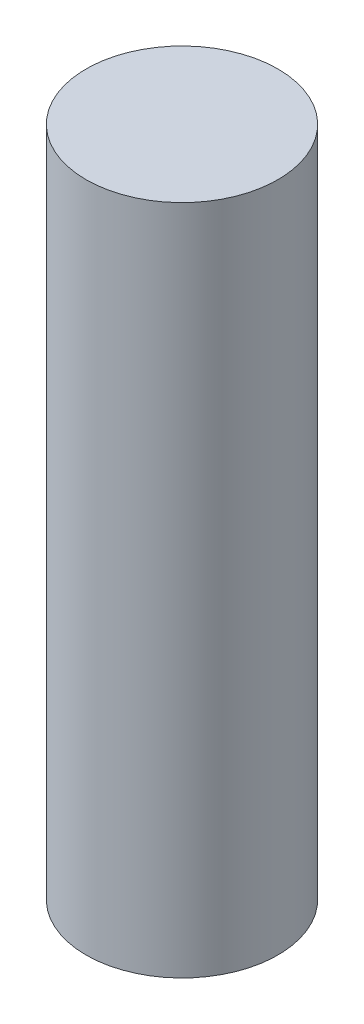
ISO-10303-21;
HEADER;
FILE_DESCRIPTION(('STEP AP214'),'2;1');
FILE_NAME('part.step','',(''),(''),'','','');
FILE_SCHEMA(('AUTOMOTIVE_DESIGN { 1 0 10303 214 1 1 1 1 }'));
ENDSEC;
DATA;
#1=APPLICATION_CONTEXT('core data for automotive mechanical design processes');
#2=APPLICATION_PROTOCOL_DEFINITION('international standard','automotive_design',2000,#1);
#3=PRODUCT_CONTEXT('',#1,'mechanical');
#4=PRODUCT('Part','Part','',(#3));
#5=PRODUCT_RELATED_PRODUCT_CATEGORY('part','',(#4));
#6=PRODUCT_DEFINITION_FORMATION('','',#4);
#7=PRODUCT_DEFINITION_CONTEXT('part definition',#1,'design');
#8=PRODUCT_DEFINITION('design','',#6,#7);
#9=PRODUCT_DEFINITION_SHAPE('','',#8);
#10=(LENGTH_UNIT() NAMED_UNIT(*) SI_UNIT(.MILLI.,.METRE.));
#11=(NAMED_UNIT(*) PLANE_ANGLE_UNIT() SI_UNIT($,.RADIAN.));
#12=(NAMED_UNIT(*) SI_UNIT($,.STERADIAN.) SOLID_ANGLE_UNIT());
#13=UNCERTAINTY_MEASURE_WITH_UNIT(LENGTH_MEASURE(1.E-05),#10,'distance_accuracy_value','');
#14=(GEOMETRIC_REPRESENTATION_CONTEXT(3) GLOBAL_UNCERTAINTY_ASSIGNED_CONTEXT((#13)) GLOBAL_UNIT_ASSIGNED_CONTEXT((#10,
#11,#12)) REPRESENTATION_CONTEXT('',''));
#15=CARTESIAN_POINT('',(0.,0.,0.));
#16=DIRECTION('',(0.,0.,1.));
#17=DIRECTION('',(1.,0.,0.));
#18=AXIS2_PLACEMENT_3D('',#15,#16,#17);
#19=CARTESIAN_POINT('',(0.,35.,0.));
#20=DIRECTION('',(0.,-1.,0.));
#21=DIRECTION('',(0.,0.,-1.));
#22=AXIS2_PLACEMENT_3D('',#19,#20,#21);
#23=CYLINDRICAL_SURFACE('',#22,5.);
#24=CARTESIAN_POINT('',(0.,35.,0.));
#25=DIRECTION('',(0.,1.,0.));
#26=DIRECTION('',(0.,0.,1.));
#27=AXIS2_PLACEMENT_3D('',#24,#25,#26);
#28=CIRCLE('',#27,5.);
#29=CARTESIAN_POINT('',(0.,35.,5.));
#30=VERTEX_POINT('',#29);
#31=EDGE_CURVE('E10',#30,#30,#28,.T.);
#32=ORIENTED_EDGE('',*,*,#31,.F.);
#33=EDGE_LOOP('',(#32));
#34=FACE_BOUND('',#33,.T.);
#35=CARTESIAN_POINT('',(0.,0.,0.));
#36=DIRECTION('',(0.,1.,0.));
#37=DIRECTION('',(0.,0.,1.));
#38=AXIS2_PLACEMENT_3D('',#35,#36,#37);
#39=CIRCLE('',#38,5.);
#40=CARTESIAN_POINT('',(0.,0.,5.));
#41=VERTEX_POINT('',#40);
#42=EDGE_CURVE('E34',#41,#41,#39,.T.);
#43=ORIENTED_EDGE('',*,*,#42,.T.);
#44=EDGE_LOOP('',(#43));
#45=FACE_BOUND('',#44,.T.);
#46=ADVANCED_FACE('F31',(#34,#45),#23,.T.);
#47=CARTESIAN_POINT('',(0.,35.,0.));
#48=DIRECTION('',(0.,1.,0.));
#49=DIRECTION('',(0.,0.,1.));
#50=AXIS2_PLACEMENT_3D('',#47,#48,#49);
#51=PLANE('',#50);
#52=ORIENTED_EDGE('',*,*,#31,.T.);
#53=EDGE_LOOP('',(#52));
#54=FACE_BOUND('',#53,.T.);
#55=ADVANCED_FACE('F46',(#54),#51,.T.);
#56=CARTESIAN_POINT('',(0.,0.,0.));
#57=DIRECTION('',(0.,1.,0.));
#58=DIRECTION('',(0.,0.,1.));
#59=AXIS2_PLACEMENT_3D('',#56,#57,#58);
#60=PLANE('',#59);
#61=ORIENTED_EDGE('',*,*,#42,.F.);
#62=EDGE_LOOP('',(#61));
#63=FACE_BOUND('',#62,.T.);
#64=ADVANCED_FACE('F44',(#63),#60,.F.);
#65=CLOSED_SHELL('',(#46,#55,#64));
#66=MANIFOLD_SOLID_BREP('B2',#65);
#67=ADVANCED_BREP_SHAPE_REPRESENTATION('',(#18,#66),#14);
#68=SHAPE_DEFINITION_REPRESENTATION(#9,#67);
ENDSEC;
END-ISO-10303-21;
